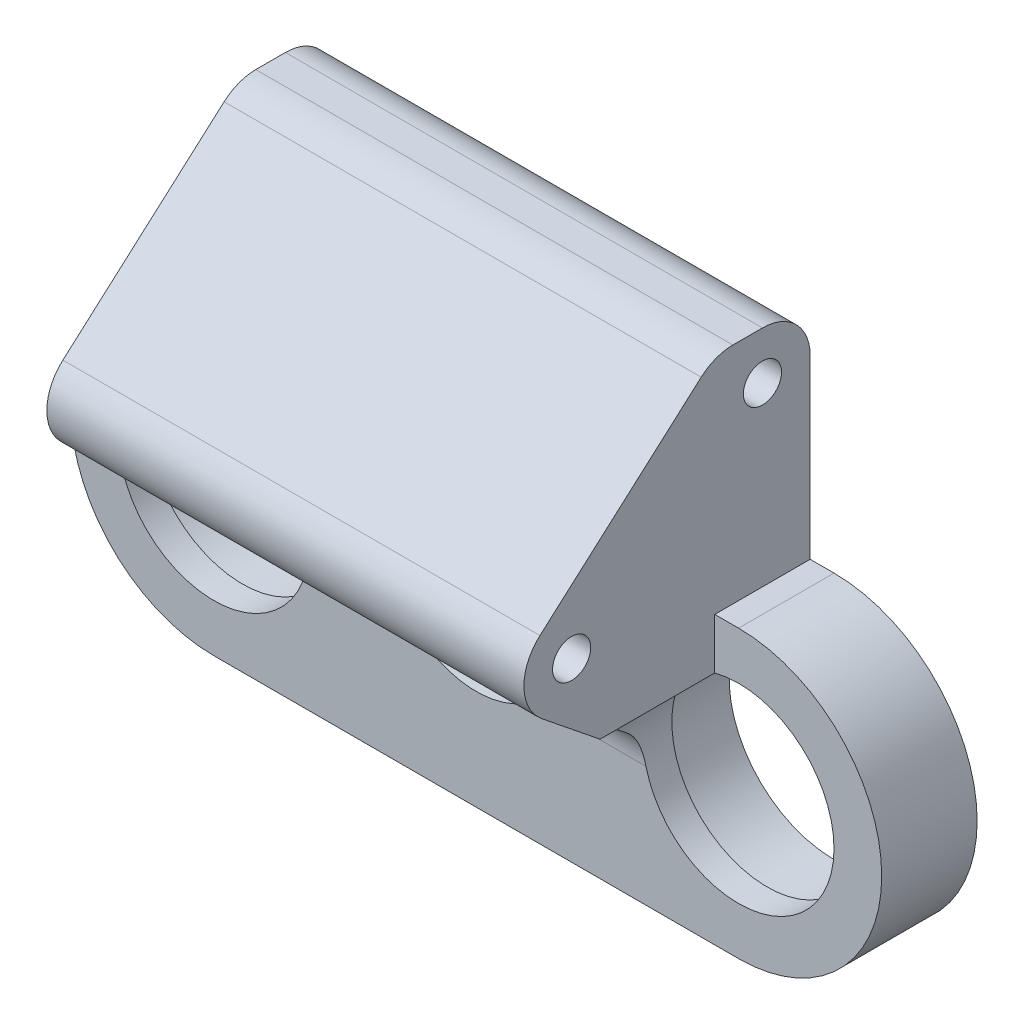
ISO-10303-21;
HEADER;
FILE_DESCRIPTION(('STEP AP214'),'2;1');
FILE_NAME('part.step','',(''),(''),'','','');
FILE_SCHEMA(('AUTOMOTIVE_DESIGN { 1 0 10303 214 1 1 1 1 }'));
ENDSEC;
DATA;
#1=APPLICATION_CONTEXT('core data for automotive mechanical design processes');
#2=APPLICATION_PROTOCOL_DEFINITION('international standard','automotive_design',2000,#1);
#3=PRODUCT_CONTEXT('',#1,'mechanical');
#4=PRODUCT('Part','Part','',(#3));
#5=PRODUCT_RELATED_PRODUCT_CATEGORY('part','',(#4));
#6=PRODUCT_DEFINITION_FORMATION('','',#4);
#7=PRODUCT_DEFINITION_CONTEXT('part definition',#1,'design');
#8=PRODUCT_DEFINITION('design','',#6,#7);
#9=PRODUCT_DEFINITION_SHAPE('','',#8);
#10=(LENGTH_UNIT() NAMED_UNIT(*) SI_UNIT(.MILLI.,.METRE.));
#11=(NAMED_UNIT(*) PLANE_ANGLE_UNIT() SI_UNIT($,.RADIAN.));
#12=(NAMED_UNIT(*) SI_UNIT($,.STERADIAN.) SOLID_ANGLE_UNIT());
#13=UNCERTAINTY_MEASURE_WITH_UNIT(LENGTH_MEASURE(1.E-05),#10,'distance_accuracy_value','');
#14=(GEOMETRIC_REPRESENTATION_CONTEXT(3) GLOBAL_UNCERTAINTY_ASSIGNED_CONTEXT((#13)) GLOBAL_UNIT_ASSIGNED_CONTEXT((#10,
#11,#12)) REPRESENTATION_CONTEXT('',''));
#15=CARTESIAN_POINT('',(0.,0.,0.));
#16=DIRECTION('',(0.,0.,1.));
#17=DIRECTION('',(1.,0.,0.));
#18=AXIS2_PLACEMENT_3D('',#15,#16,#17);
#19=CARTESIAN_POINT('',(0.,15.,10.));
#20=DIRECTION('',(0.,-1.,0.));
#21=DIRECTION('',(1.,0.,0.));
#22=AXIS2_PLACEMENT_3D('',#19,#20,#21);
#23=PLANE('',#22);
#24=DIRECTION('',(0.,0.,1.));
#25=VECTOR('',#24,1.);
#26=CARTESIAN_POINT('',(-25.,15.,0.));
#27=LINE('',#26,#25);
#28=CARTESIAN_POINT('',(-25.,15.,0.));
#29=VERTEX_POINT('',#28);
#30=CARTESIAN_POINT('',(-25.,15.,10.));
#31=VERTEX_POINT('',#30);
#32=EDGE_CURVE('E236',#29,#31,#27,.T.);
#33=ORIENTED_EDGE('',*,*,#32,.F.);
#34=DIRECTION('',(-1.,0.,0.));
#35=VECTOR('',#34,1.);
#36=CARTESIAN_POINT('',(0.,15.,0.));
#37=LINE('',#36,#35);
#38=CARTESIAN_POINT('',(-27.5,15.,0.));
#39=VERTEX_POINT('',#38);
#40=EDGE_CURVE('E277',#29,#39,#37,.T.);
#41=ORIENTED_EDGE('',*,*,#40,.T.);
#42=DIRECTION('',(0.,0.,-1.));
#43=VECTOR('',#42,1.);
#44=CARTESIAN_POINT('',(-27.5,15.,10.));
#45=LINE('',#44,#43);
#46=CARTESIAN_POINT('',(-27.5,15.,10.));
#47=VERTEX_POINT('',#46);
#48=EDGE_CURVE('E297',#47,#39,#45,.T.);
#49=ORIENTED_EDGE('',*,*,#48,.F.);
#50=DIRECTION('',(-1.,0.,0.));
#51=VECTOR('',#50,1.);
#52=CARTESIAN_POINT('',(0.,15.,10.));
#53=LINE('',#52,#51);
#54=EDGE_CURVE('E266',#31,#47,#53,.T.);
#55=ORIENTED_EDGE('',*,*,#54,.F.);
#56=EDGE_LOOP('',(#33,#41,#49,#55));
#57=FACE_BOUND('',#56,.T.);
#58=ADVANCED_FACE('F88',(#57),#23,.F.);
#59=CARTESIAN_POINT('',(0.,5.,10.));
#60=DIRECTION('',(0.,0.,-1.));
#61=DIRECTION('',(-1.,0.,0.));
#62=AXIS2_PLACEMENT_3D('',#59,#60,#61);
#63=CYLINDRICAL_SURFACE('',#62,9.5);
#64=CARTESIAN_POINT('',(0.,5.,16.208531287974));
#65=DIRECTION('',(0.,0.778834606726929,-0.627229348296545));
#66=DIRECTION('',(0.,-0.627229348296546,-0.77883460672693));
#67=AXIS2_PLACEMENT_3D('',#64,#65,#66);
#68=ELLIPSE('',#67,15.1459749544572,9.49999999999999);
#69=CARTESIAN_POINT('',(-8.83217374117434,1.50104201143964,11.8638532585173));
#70=VERTEX_POINT('',#69);
#71=CARTESIAN_POINT('',(8.83217374117434,1.50104201143964,11.8638532585173));
#72=VERTEX_POINT('',#71);
#73=EDGE_CURVE('E229',#70,#72,#68,.T.);
#74=ORIENTED_EDGE('',*,*,#73,.F.);
#75=CARTESIAN_POINT('',(-8.83217374117434,1.50104201143964,11.8638532585173));
#76=CARTESIAN_POINT('',(-8.79937837870814,1.41823773642315,11.7609838896426));
#77=CARTESIAN_POINT('',(-8.76376212731212,1.33175386015534,11.6619850211199));
#78=CARTESIAN_POINT('',(-8.68659905168116,1.15260280425315,11.4722955232034));
#79=CARTESIAN_POINT('',(-8.64505397800075,1.05993745405752,11.3816024543554));
#80=CARTESIAN_POINT('',(-8.55618956159777,0.870538286898988,11.2099270694883));
#81=CARTESIAN_POINT('',(-8.50893469998546,0.773856746149045,11.1288536473952));
#82=CARTESIAN_POINT('',(-8.40815792708898,0.57675153764262,10.9756525379476));
#83=CARTESIAN_POINT('',(-8.35463603182304,0.476327879451257,10.9035248277292));
#84=CARTESIAN_POINT('',(-8.24128435598691,0.272973418198548,10.7683578288384));
#85=CARTESIAN_POINT('',(-8.18145488405915,0.170042738000187,10.70531809583));
#86=CARTESIAN_POINT('',(-8.05553731637715,-0.0371641159293095,10.588244337141));
#87=CARTESIAN_POINT('',(-7.9894466138641,-0.141440834316979,10.5342140884769));
#88=CARTESIAN_POINT('',(-7.85090641147902,-0.350614079117348,10.4347402698558));
#89=CARTESIAN_POINT('',(-7.77843040309506,-0.455511323600859,10.3893352283801));
#90=CARTESIAN_POINT('',(-7.62763179995241,-0.66443685079868,10.3070019116986));
#91=CARTESIAN_POINT('',(-7.5493080106808,-0.768464951122962,10.2700753746901));
#92=CARTESIAN_POINT('',(-7.35999751433599,-1.00924781283061,10.1931567810846));
#93=CARTESIAN_POINT('',(-7.24685094969099,-1.14530576542051,10.1562734611221));
#94=CARTESIAN_POINT('',(-7.01153351893997,-1.41249947359612,10.0951891957309));
#95=CARTESIAN_POINT('',(-6.88935544716596,-1.54363117025511,10.0709985043054));
#96=CARTESIAN_POINT('',(-6.63757538882861,-1.79886272278748,10.0337736638761));
#97=CARTESIAN_POINT('',(-6.50801360133452,-1.92299447614091,10.0206843053133));
#98=CARTESIAN_POINT('',(-6.24196966997879,-2.16380523584075,10.0038080605852));
#99=CARTESIAN_POINT('',(-6.10550030484822,-2.28049716224859,10.0000045948124));
#100=CARTESIAN_POINT('',(-5.96587074019022,-2.39313102219501,10.));
#101=B_SPLINE_CURVE_WITH_KNOTS('',3,(#75,#76,#77,#78,#79,#80,#81,#82,#83,#84,#85,#86,#87,#88,
#89,#90,#91,#92,#93,#94,#95,#96,#97,#98,#99,#100),.UNSPECIFIED.,.F.,.F.,(4,2,2,2,2,2,2,2,2,2,2,
2,4),(0.,0.408059896019089,0.815999555881481,1.21970062575822,1.62340066381697,2.02708095718018,
2.4309300609278,2.83654277644303,3.24223857342848,3.78368523090544,4.32556863640213,
4.864741055292,5.40295009606931),.UNSPECIFIED.);
#102=CARTESIAN_POINT('',(-5.96587074019022,-2.39313102219501,10.));
#103=VERTEX_POINT('',#102);
#104=EDGE_CURVE('E12',#70,#103,#101,.T.);
#105=ORIENTED_EDGE('',*,*,#104,.T.);
#106=CARTESIAN_POINT('',(0.,5.,10.));
#107=DIRECTION('',(0.,0.,1.));
#108=DIRECTION('',(1.,0.,0.));
#109=AXIS2_PLACEMENT_3D('',#106,#107,#108);
#110=CIRCLE('',#109,9.5);
#111=CARTESIAN_POINT('',(5.96587074019022,-2.39313102219501,10.));
#112=VERTEX_POINT('',#111);
#113=EDGE_CURVE('E260',#103,#112,#110,.T.);
#114=ORIENTED_EDGE('',*,*,#113,.T.);
#115=CARTESIAN_POINT('',(5.96587074019022,-2.39313102219501,10.));
#116=CARTESIAN_POINT('',(6.10347010421152,-2.28213280439098,10.000004553618));
#117=CARTESIAN_POINT('',(6.23799945369006,-2.16719728646805,10.0036982063082));
#118=CARTESIAN_POINT('',(6.50036018826438,-1.93011427407039,10.0200626561571));
#119=CARTESIAN_POINT('',(6.62818008363108,-1.80795512404933,10.0327483456982));
#120=CARTESIAN_POINT('',(6.87681744720314,-1.5567387766679,10.0688101389606));
#121=CARTESIAN_POINT('',(6.99759023961192,-1.42764583405689,10.0922475242973));
#122=CARTESIAN_POINT('',(7.23039237811504,-1.16459426403602,10.1514074761815));
#123=CARTESIAN_POINT('',(7.34242789636078,-1.0306391711748,10.1871212722399));
#124=CARTESIAN_POINT('',(7.53542778367279,-0.786746528157732,10.2637119341491));
#125=CARTESIAN_POINT('',(7.61811309282972,-0.677389127423526,10.3021109280263));
#126=CARTESIAN_POINT('',(7.77701996070737,-0.457685109848573,10.3882796492948));
#127=CARTESIAN_POINT('',(7.85324287011983,-0.347338705074901,10.4360474115909));
#128=CARTESIAN_POINT('',(7.998570067161,-0.12739408276485,10.5411638937111));
#129=CARTESIAN_POINT('',(8.06770693239291,-0.0177948243950194,10.5984652658472));
#130=CARTESIAN_POINT('',(8.19906919237147,0.199852346082415,10.723067087673));
#131=CARTESIAN_POINT('',(8.26129526352045,0.307900409112185,10.7903665572768));
#132=CARTESIAN_POINT('',(8.37408725717405,0.512549441588461,10.9292417488496));
#133=CARTESIAN_POINT('',(8.42518704418424,0.609377019336433,11.0000507376948));
#134=CARTESIAN_POINT('',(8.52152538787706,0.799410158582833,11.1500215470849));
#135=CARTESIAN_POINT('',(8.5667642859028,0.892615930796725,11.2291828806945));
#136=CARTESIAN_POINT('',(8.65195219325743,1.07521103153369,11.3963827166724));
#137=CARTESIAN_POINT('',(8.69184466471507,1.16455368545048,11.4845010299503));
#138=CARTESIAN_POINT('',(8.76609595701615,1.33742595778112,11.6684899039356));
#139=CARTESIAN_POINT('',(8.80045305368584,1.42095376038591,11.7643628661689));
#140=CARTESIAN_POINT('',(8.83217374117434,1.50104201143964,11.8638532585173));
#141=B_SPLINE_CURVE_WITH_KNOTS('',3,(#115,#116,#117,#118,#119,#120,#121,#122,#123,#124,#125,
#126,#127,#128,#129,#130,#131,#132,#133,#134,#135,#136,#137,#138,#139,#140),.UNSPECIFIED.,.F.,
.F.,(4,2,2,2,2,2,2,2,2,2,2,2,4),(0.,0.530383753442043,1.06164797354417,1.59597860945558,
2.12992830058184,2.55663011642034,2.98324252727124,3.4077962144304,3.83230831119545,
4.22303141921132,4.61373176094453,5.00828323637127,5.40295737116777),.UNSPECIFIED.);
#142=EDGE_CURVE('E109',#112,#72,#141,.T.);
#143=ORIENTED_EDGE('',*,*,#142,.T.);
#144=EDGE_LOOP('',(#74,#105,#114,#143));
#145=FACE_BOUND('',#144,.T.);
#146=CARTESIAN_POINT('',(0.,5.,4.));
#147=DIRECTION('',(0.,0.,-1.));
#148=DIRECTION('',(-1.,0.,0.));
#149=AXIS2_PLACEMENT_3D('',#146,#147,#148);
#150=CIRCLE('',#149,9.5);
#151=CARTESIAN_POINT('',(-9.5,5.,4.));
#152=VERTEX_POINT('',#151);
#153=EDGE_CURVE('E444',#152,#152,#150,.T.);
#154=ORIENTED_EDGE('',*,*,#153,.T.);
#155=EDGE_LOOP('',(#154));
#156=FACE_BOUND('',#155,.T.);
#157=ADVANCED_FACE('F351',(#145,#156),#63,.F.);
#158=CARTESIAN_POINT('',(27.5,0.,10.));
#159=DIRECTION('',(0.,0.,-1.));
#160=DIRECTION('',(-1.,0.,0.));
#161=AXIS2_PLACEMENT_3D('',#158,#159,#160);
#162=CYLINDRICAL_SURFACE('',#161,11.);
#163=CARTESIAN_POINT('',(27.5,0.,0.));
#164=DIRECTION('',(0.,0.,1.));
#165=DIRECTION('',(1.,0.,0.));
#166=AXIS2_PLACEMENT_3D('',#163,#164,#165);
#167=CIRCLE('',#166,11.);
#168=CARTESIAN_POINT('',(38.5,0.,0.));
#169=VERTEX_POINT('',#168);
#170=EDGE_CURVE('E286',#169,#169,#167,.T.);
#171=ORIENTED_EDGE('',*,*,#170,.F.);
#172=EDGE_LOOP('',(#171));
#173=FACE_BOUND('',#172,.T.);
#174=CARTESIAN_POINT('',(27.5,0.,7.));
#175=DIRECTION('',(0.,0.,1.));
#176=DIRECTION('',(1.,0.,0.));
#177=AXIS2_PLACEMENT_3D('',#174,#175,#176);
#178=CIRCLE('',#177,11.);
#179=CARTESIAN_POINT('',(38.5,0.,7.));
#180=VERTEX_POINT('',#179);
#181=EDGE_CURVE('E248',#180,#180,#178,.T.);
#182=ORIENTED_EDGE('',*,*,#181,.T.);
#183=EDGE_LOOP('',(#182));
#184=FACE_BOUND('',#183,.T.);
#185=ADVANCED_FACE('F356',(#173,#184),#162,.F.);
#186=CARTESIAN_POINT('',(-27.5,0.,10.));
#187=DIRECTION('',(0.,0.,-1.));
#188=DIRECTION('',(-1.,0.,0.));
#189=AXIS2_PLACEMENT_3D('',#186,#187,#188);
#190=CYLINDRICAL_SURFACE('',#189,11.);
#191=CARTESIAN_POINT('',(-27.5,0.,0.));
#192=DIRECTION('',(0.,0.,1.));
#193=DIRECTION('',(1.,0.,0.));
#194=AXIS2_PLACEMENT_3D('',#191,#192,#193);
#195=CIRCLE('',#194,11.);
#196=CARTESIAN_POINT('',(-16.5,0.,0.));
#197=VERTEX_POINT('',#196);
#198=EDGE_CURVE('E263',#197,#197,#195,.T.);
#199=ORIENTED_EDGE('',*,*,#198,.F.);
#200=EDGE_LOOP('',(#199));
#201=FACE_BOUND('',#200,.T.);
#202=CARTESIAN_POINT('',(-27.5,0.,7.));
#203=DIRECTION('',(0.,0.,1.));
#204=DIRECTION('',(1.,0.,0.));
#205=AXIS2_PLACEMENT_3D('',#202,#203,#204);
#206=CIRCLE('',#205,11.);
#207=CARTESIAN_POINT('',(-16.5,0.,7.));
#208=VERTEX_POINT('',#207);
#209=EDGE_CURVE('E251',#208,#208,#206,.T.);
#210=ORIENTED_EDGE('',*,*,#209,.T.);
#211=EDGE_LOOP('',(#210));
#212=FACE_BOUND('',#211,.T.);
#213=ADVANCED_FACE('F382',(#201,#212),#190,.F.);
#214=CARTESIAN_POINT('',(27.5,15.,0.));
#215=VERTEX_POINT('',#214);
#216=CARTESIAN_POINT('',(25.,15.,0.));
#217=VERTEX_POINT('',#216);
#218=EDGE_CURVE('E259',#215,#217,#37,.T.);
#219=ORIENTED_EDGE('',*,*,#218,.T.);
#220=DIRECTION('',(0.,0.,1.));
#221=VECTOR('',#220,1.);
#222=CARTESIAN_POINT('',(25.,15.,0.));
#223=LINE('',#222,#221);
#224=CARTESIAN_POINT('',(25.,15.,10.));
#225=VERTEX_POINT('',#224);
#226=EDGE_CURVE('E396',#217,#225,#223,.T.);
#227=ORIENTED_EDGE('',*,*,#226,.T.);
#228=CARTESIAN_POINT('',(27.5,15.,10.));
#229=VERTEX_POINT('',#228);
#230=EDGE_CURVE('E262',#229,#225,#53,.T.);
#231=ORIENTED_EDGE('',*,*,#230,.F.);
#232=DIRECTION('',(0.,0.,-1.));
#233=VECTOR('',#232,1.);
#234=CARTESIAN_POINT('',(27.5,15.,10.));
#235=LINE('',#234,#233);
#236=EDGE_CURVE('E274',#229,#215,#235,.T.);
#237=ORIENTED_EDGE('',*,*,#236,.T.);
#238=EDGE_LOOP('',(#219,#227,#231,#237));
#239=FACE_BOUND('',#238,.T.);
#240=ADVANCED_FACE('F377',(#239),#23,.F.);
#241=CARTESIAN_POINT('',(-27.5,0.,10.));
#242=DIRECTION('',(0.,0.,-1.));
#243=DIRECTION('',(-1.,0.,0.));
#244=AXIS2_PLACEMENT_3D('',#241,#242,#243);
#245=CYLINDRICAL_SURFACE('',#244,15.);
#246=CARTESIAN_POINT('',(-27.5,0.,0.));
#247=DIRECTION('',(0.,0.,1.));
#248=DIRECTION('',(1.,0.,0.));
#249=AXIS2_PLACEMENT_3D('',#246,#247,#248);
#250=CIRCLE('',#249,15.);
#251=CARTESIAN_POINT('',(-27.5,-15.,0.));
#252=VERTEX_POINT('',#251);
#253=EDGE_CURVE('E278',#39,#252,#250,.T.);
#254=ORIENTED_EDGE('',*,*,#253,.T.);
#255=DIRECTION('',(0.,0.,-1.));
#256=VECTOR('',#255,1.);
#257=CARTESIAN_POINT('',(-27.5,-15.,10.));
#258=LINE('',#257,#256);
#259=CARTESIAN_POINT('',(-27.5,-15.,10.));
#260=VERTEX_POINT('',#259);
#261=EDGE_CURVE('E295',#260,#252,#258,.T.);
#262=ORIENTED_EDGE('',*,*,#261,.F.);
#263=CARTESIAN_POINT('',(-27.5,0.,10.));
#264=DIRECTION('',(0.,0.,1.));
#265=DIRECTION('',(1.,0.,0.));
#266=AXIS2_PLACEMENT_3D('',#263,#264,#265);
#267=CIRCLE('',#266,15.);
#268=EDGE_CURVE('E267',#47,#260,#267,.T.);
#269=ORIENTED_EDGE('',*,*,#268,.F.);
#270=ORIENTED_EDGE('',*,*,#48,.T.);
#271=EDGE_LOOP('',(#254,#262,#269,#270));
#272=FACE_BOUND('',#271,.T.);
#273=ADVANCED_FACE('F381',(#272),#245,.T.);
#274=CARTESIAN_POINT('',(0.,-15.,10.));
#275=DIRECTION('',(0.,-1.,0.));
#276=DIRECTION('',(1.,0.,0.));
#277=AXIS2_PLACEMENT_3D('',#274,#275,#276);
#278=PLANE('',#277);
#279=DIRECTION('',(-1.,0.,0.));
#280=VECTOR('',#279,1.);
#281=CARTESIAN_POINT('',(0.,-15.,0.));
#282=LINE('',#281,#280);
#283=CARTESIAN_POINT('',(27.5,-15.,0.));
#284=VERTEX_POINT('',#283);
#285=EDGE_CURVE('E281',#284,#252,#282,.T.);
#286=ORIENTED_EDGE('',*,*,#285,.F.);
#287=DIRECTION('',(0.,0.,-1.));
#288=VECTOR('',#287,1.);
#289=CARTESIAN_POINT('',(27.5,-15.,10.));
#290=LINE('',#289,#288);
#291=CARTESIAN_POINT('',(27.5,-15.,10.));
#292=VERTEX_POINT('',#291);
#293=EDGE_CURVE('E293',#292,#284,#290,.T.);
#294=ORIENTED_EDGE('',*,*,#293,.F.);
#295=DIRECTION('',(-1.,0.,0.));
#296=VECTOR('',#295,1.);
#297=CARTESIAN_POINT('',(0.,-15.,10.));
#298=LINE('',#297,#296);
#299=EDGE_CURVE('E269',#292,#260,#298,.T.);
#300=ORIENTED_EDGE('',*,*,#299,.T.);
#301=ORIENTED_EDGE('',*,*,#261,.T.);
#302=EDGE_LOOP('',(#286,#294,#300,#301));
#303=FACE_BOUND('',#302,.T.);
#304=ADVANCED_FACE('F388',(#303),#278,.T.);
#305=CARTESIAN_POINT('',(27.5,0.,10.));
#306=DIRECTION('',(0.,0.,-1.));
#307=DIRECTION('',(-1.,0.,0.));
#308=AXIS2_PLACEMENT_3D('',#305,#306,#307);
#309=CYLINDRICAL_SURFACE('',#308,15.);
#310=CARTESIAN_POINT('',(27.5,0.,0.));
#311=DIRECTION('',(0.,0.,1.));
#312=DIRECTION('',(1.,0.,0.));
#313=AXIS2_PLACEMENT_3D('',#310,#311,#312);
#314=CIRCLE('',#313,15.);
#315=EDGE_CURVE('E284',#284,#215,#314,.T.);
#316=ORIENTED_EDGE('',*,*,#315,.T.);
#317=ORIENTED_EDGE('',*,*,#236,.F.);
#318=CARTESIAN_POINT('',(27.5,0.,10.));
#319=DIRECTION('',(0.,0.,1.));
#320=DIRECTION('',(1.,0.,0.));
#321=AXIS2_PLACEMENT_3D('',#318,#319,#320);
#322=CIRCLE('',#321,15.);
#323=EDGE_CURVE('E272',#292,#229,#322,.T.);
#324=ORIENTED_EDGE('',*,*,#323,.F.);
#325=ORIENTED_EDGE('',*,*,#293,.T.);
#326=EDGE_LOOP('',(#316,#317,#324,#325));
#327=FACE_BOUND('',#326,.T.);
#328=ADVANCED_FACE('F464',(#327),#309,.T.);
#329=CARTESIAN_POINT('',(0.,0.,10.));
#330=DIRECTION('',(0.,0.,1.));
#331=DIRECTION('',(1.,0.,0.));
#332=AXIS2_PLACEMENT_3D('',#329,#330,#331);
#333=PLANE('',#332);
#334=CARTESIAN_POINT('',(27.5,0.,10.));
#335=DIRECTION('',(0.,0.,1.));
#336=DIRECTION('',(1.,0.,0.));
#337=AXIS2_PLACEMENT_3D('',#334,#335,#336);
#338=CIRCLE('',#337,9.99999999999999);
#339=CARTESIAN_POINT('',(17.7905755108448,-2.39313102219501,10.));
#340=VERTEX_POINT('',#339);
#341=CARTESIAN_POINT('',(25.,9.68245836551854,10.));
#342=VERTEX_POINT('',#341);
#343=EDGE_CURVE('E449',#340,#342,#338,.T.);
#344=ORIENTED_EDGE('',*,*,#343,.F.);
#345=DIRECTION('',(-1.,0.,0.));
#346=VECTOR('',#345,1.);
#347=CARTESIAN_POINT('',(0.,-2.39313102219501,10.));
#348=LINE('',#347,#346);
#349=EDGE_CURVE('E331',#340,#112,#348,.T.);
#350=ORIENTED_EDGE('',*,*,#349,.T.);
#351=ORIENTED_EDGE('',*,*,#113,.F.);
#352=DIRECTION('',(-1.,0.,0.));
#353=VECTOR('',#352,1.);
#354=CARTESIAN_POINT('',(0.,-2.39313102219501,10.));
#355=LINE('',#354,#353);
#356=CARTESIAN_POINT('',(-17.7905755108447,-2.39313102219501,10.));
#357=VERTEX_POINT('',#356);
#358=EDGE_CURVE('E246',#103,#357,#355,.T.);
#359=ORIENTED_EDGE('',*,*,#358,.T.);
#360=CARTESIAN_POINT('',(-27.5,0.,10.));
#361=DIRECTION('',(0.,0.,1.));
#362=DIRECTION('',(1.,0.,0.));
#363=AXIS2_PLACEMENT_3D('',#360,#361,#362);
#364=CIRCLE('',#363,10.);
#365=CARTESIAN_POINT('',(-25.,9.68245836551853,10.));
#366=VERTEX_POINT('',#365);
#367=EDGE_CURVE('E223',#366,#357,#364,.T.);
#368=ORIENTED_EDGE('',*,*,#367,.F.);
#369=DIRECTION('',(0.,-1.,0.));
#370=VECTOR('',#369,1.);
#371=CARTESIAN_POINT('',(-25.,15.,10.));
#372=LINE('',#371,#370);
#373=EDGE_CURVE('E232',#31,#366,#372,.T.);
#374=ORIENTED_EDGE('',*,*,#373,.F.);
#375=ORIENTED_EDGE('',*,*,#54,.T.);
#376=ORIENTED_EDGE('',*,*,#268,.T.);
#377=ORIENTED_EDGE('',*,*,#299,.F.);
#378=ORIENTED_EDGE('',*,*,#323,.T.);
#379=ORIENTED_EDGE('',*,*,#230,.T.);
#380=DIRECTION('',(0.,-1.,0.));
#381=VECTOR('',#380,1.);
#382=CARTESIAN_POINT('',(25.,15.,10.));
#383=LINE('',#382,#381);
#384=EDGE_CURVE('E415',#225,#342,#383,.T.);
#385=ORIENTED_EDGE('',*,*,#384,.T.);
#386=EDGE_LOOP('',(#344,#350,#351,#359,#368,#374,#375,#376,#377,#378,#379,#385));
#387=FACE_BOUND('',#386,.T.);
#388=ADVANCED_FACE('F243',(#387),#333,.T.);
#389=CARTESIAN_POINT('',(0.,0.,0.));
#390=DIRECTION('',(0.,0.,1.));
#391=DIRECTION('',(1.,0.,0.));
#392=AXIS2_PLACEMENT_3D('',#389,#390,#391);
#393=PLANE('',#392);
#394=DIRECTION('',(0.,1.,0.));
#395=VECTOR('',#394,1.);
#396=CARTESIAN_POINT('',(-25.,15.,0.));
#397=LINE('',#396,#395);
#398=CARTESIAN_POINT('',(-25.,33.5,0.));
#399=VERTEX_POINT('',#398);
#400=EDGE_CURVE('E416',#29,#399,#397,.T.);
#401=ORIENTED_EDGE('',*,*,#400,.T.);
#402=DIRECTION('',(-1.,0.,0.));
#403=VECTOR('',#402,1.);
#404=CARTESIAN_POINT('',(0.,33.5,0.));
#405=LINE('',#404,#403);
#406=CARTESIAN_POINT('',(25.,33.5,0.));
#407=VERTEX_POINT('',#406);
#408=EDGE_CURVE('E325',#399,#407,#405,.F.);
#409=ORIENTED_EDGE('',*,*,#408,.T.);
#410=DIRECTION('',(0.,1.,0.));
#411=VECTOR('',#410,1.);
#412=CARTESIAN_POINT('',(25.,18.5,0.));
#413=LINE('',#412,#411);
#414=EDGE_CURVE('E405',#217,#407,#413,.T.);
#415=ORIENTED_EDGE('',*,*,#414,.F.);
#416=ORIENTED_EDGE('',*,*,#218,.F.);
#417=ORIENTED_EDGE('',*,*,#315,.F.);
#418=ORIENTED_EDGE('',*,*,#285,.T.);
#419=ORIENTED_EDGE('',*,*,#253,.F.);
#420=ORIENTED_EDGE('',*,*,#40,.F.);
#421=EDGE_LOOP('',(#401,#409,#415,#416,#417,#418,#419,#420));
#422=FACE_BOUND('',#421,.T.);
#423=ORIENTED_EDGE('',*,*,#170,.T.);
#424=EDGE_LOOP('',(#423));
#425=FACE_BOUND('',#424,.T.);
#426=ORIENTED_EDGE('',*,*,#198,.T.);
#427=EDGE_LOOP('',(#426));
#428=FACE_BOUND('',#427,.T.);
#429=CARTESIAN_POINT('',(0.,5.,0.));
#430=DIRECTION('',(0.,0.,-1.));
#431=DIRECTION('',(-1.,0.,0.));
#432=AXIS2_PLACEMENT_3D('',#429,#430,#431);
#433=CIRCLE('',#432,8.5);
#434=CARTESIAN_POINT('',(-8.5,5.,0.));
#435=VERTEX_POINT('',#434);
#436=EDGE_CURVE('E408',#435,#435,#433,.T.);
#437=ORIENTED_EDGE('',*,*,#436,.F.);
#438=EDGE_LOOP('',(#437));
#439=FACE_BOUND('',#438,.T.);
#440=ADVANCED_FACE('F401',(#422,#425,#428,#439),#393,.F.);
#441=CARTESIAN_POINT('',(-27.5,0.,7.));
#442=DIRECTION('',(0.,0.,1.));
#443=DIRECTION('',(1.,0.,0.));
#444=AXIS2_PLACEMENT_3D('',#441,#442,#443);
#445=PLANE('',#444);
#446=CARTESIAN_POINT('',(-27.5,0.,7.));
#447=DIRECTION('',(0.,0.,1.));
#448=DIRECTION('',(1.,0.,0.));
#449=AXIS2_PLACEMENT_3D('',#446,#447,#448);
#450=CIRCLE('',#449,10.);
#451=CARTESIAN_POINT('',(-17.5,0.,7.));
#452=VERTEX_POINT('',#451);
#453=EDGE_CURVE('E247',#452,#452,#450,.T.);
#454=ORIENTED_EDGE('',*,*,#453,.T.);
#455=EDGE_LOOP('',(#454));
#456=FACE_BOUND('',#455,.T.);
#457=ORIENTED_EDGE('',*,*,#209,.F.);
#458=EDGE_LOOP('',(#457));
#459=FACE_BOUND('',#458,.T.);
#460=ADVANCED_FACE('F498',(#456,#459),#445,.F.);
#461=CARTESIAN_POINT('',(-27.5,0.,7.));
#462=DIRECTION('',(0.,0.,1.));
#463=DIRECTION('',(1.,0.,0.));
#464=AXIS2_PLACEMENT_3D('',#461,#462,#463);
#465=CYLINDRICAL_SURFACE('',#464,10.);
#466=ORIENTED_EDGE('',*,*,#453,.F.);
#467=EDGE_LOOP('',(#466));
#468=FACE_BOUND('',#467,.T.);
#469=ORIENTED_EDGE('',*,*,#367,.T.);
#470=CARTESIAN_POINT('',(-17.7905755108447,-2.39313102219501,10.));
#471=CARTESIAN_POINT('',(-17.7596707834307,-2.26783575926706,9.9999795711148));
#472=CARTESIAN_POINT('',(-17.731230295553,-2.14191993462361,10.0047091885669));
#473=CARTESIAN_POINT('',(-17.6793496933688,-1.88978238771914,10.023799467444));
#474=CARTESIAN_POINT('',(-17.6559098810544,-1.76356064744906,10.0381607103084));
#475=CARTESIAN_POINT('',(-17.6141898237008,-1.51226510359151,10.0765683091091));
#476=CARTESIAN_POINT('',(-17.595889329084,-1.38718872818552,10.1005757217261));
#477=CARTESIAN_POINT('',(-17.5642490758504,-1.1386560593183,10.1582480748786));
#478=CARTESIAN_POINT('',(-17.5509089405862,-1.01519964353815,10.1919122818155));
#479=CARTESIAN_POINT('',(-17.5289873185559,-0.770708243773723,10.2688070872331));
#480=CARTESIAN_POINT('',(-17.5204115297455,-0.649676325344922,10.3120490542718));
#481=CARTESIAN_POINT('',(-17.5077375211924,-0.41106382830339,10.4078385193368));
#482=CARTESIAN_POINT('',(-17.5036409999236,-0.293484575325932,10.4603895384514));
#483=CARTESIAN_POINT('',(-17.4995293195947,-0.0626091338701522,10.5744775278757));
#484=CARTESIAN_POINT('',(-17.4995164328864,0.0506846348799591,10.6360194821668));
#485=CARTESIAN_POINT('',(-17.5030893501764,0.272153637379084,10.7676386227989));
#486=CARTESIAN_POINT('',(-17.5066765149268,0.38032691949018,10.8377190277144));
#487=CARTESIAN_POINT('',(-17.5210759888487,0.676349738432519,11.0461933064468));
#488=CARTESIAN_POINT('',(-17.5353888221899,0.857649416562944,11.1938868325461));
#489=CARTESIAN_POINT('',(-17.5616847358757,1.11230258014236,11.432714102411));
#490=CARTESIAN_POINT('',(-17.5712510643283,1.19428329917538,11.5151783424487));
#491=CARTESIAN_POINT('',(-17.5915300967936,1.35223368426126,11.6855311258444));
#492=CARTESIAN_POINT('',(-17.6022426985908,1.42820388523425,11.7734191852549));
#493=CARTESIAN_POINT('',(-17.6132981798836,1.50104201143964,11.8638532585173));
#494=B_SPLINE_CURVE_WITH_KNOTS('',3,(#470,#471,#472,#473,#474,#475,#476,#477,#478,#479,#480,
#481,#482,#483,#484,#485,#486,#487,#488,#489,#490,#491,#492,#493),.UNSPECIFIED.,.F.,.F.,(4,2,2,
2,2,2,2,2,2,2,2,4),(0.,0.387057987245352,0.774139342407724,1.15967343515574,1.54517824774905,
1.93114312060777,2.31725429510548,2.70358032205227,3.09005242803032,3.790031922393,
4.13982195858646,4.4895808292968),.UNSPECIFIED.);
#495=CARTESIAN_POINT('',(-17.6132981798836,1.50104201143964,11.8638532585173));
#496=VERTEX_POINT('',#495);
#497=EDGE_CURVE('E102',#357,#496,#494,.T.);
#498=ORIENTED_EDGE('',*,*,#497,.T.);
#499=CARTESIAN_POINT('',(-27.5,0.,9.99999999999998));
#500=DIRECTION('',(0.,0.778834606726929,-0.627229348296545));
#501=DIRECTION('',(0.,-0.627229348296546,-0.77883460672693));
#502=AXIS2_PLACEMENT_3D('',#499,#500,#501);
#503=ELLIPSE('',#502,15.9431315310076,10.);
#504=CARTESIAN_POINT('',(-25.,9.68245836551853,22.0227691413655));
#505=VERTEX_POINT('',#504);
#506=EDGE_CURVE('E224',#505,#496,#503,.T.);
#507=ORIENTED_EDGE('',*,*,#506,.F.);
#508=DIRECTION('',(0.,0.,-1.));
#509=VECTOR('',#508,1.);
#510=CARTESIAN_POINT('',(-25.,9.68245836551853,60.));
#511=LINE('',#510,#509);
#512=EDGE_CURVE('E219',#366,#505,#511,.F.);
#513=ORIENTED_EDGE('',*,*,#512,.F.);
#514=EDGE_LOOP('',(#469,#498,#507,#513));
#515=FACE_BOUND('',#514,.T.);
#516=ADVANCED_FACE('F221',(#468,#515),#465,.F.);
#517=CARTESIAN_POINT('',(27.5,0.,7.));
#518=DIRECTION('',(0.,0.,1.));
#519=DIRECTION('',(1.,0.,0.));
#520=AXIS2_PLACEMENT_3D('',#517,#518,#519);
#521=PLANE('',#520);
#522=CARTESIAN_POINT('',(27.5,0.,7.));
#523=DIRECTION('',(0.,0.,1.));
#524=DIRECTION('',(1.,0.,0.));
#525=AXIS2_PLACEMENT_3D('',#522,#523,#524);
#526=CIRCLE('',#525,9.99999999999999);
#527=CARTESIAN_POINT('',(37.5,0.,7.));
#528=VERTEX_POINT('',#527);
#529=EDGE_CURVE('E254',#528,#528,#526,.T.);
#530=ORIENTED_EDGE('',*,*,#529,.T.);
#531=EDGE_LOOP('',(#530));
#532=FACE_BOUND('',#531,.T.);
#533=ORIENTED_EDGE('',*,*,#181,.F.);
#534=EDGE_LOOP('',(#533));
#535=FACE_BOUND('',#534,.T.);
#536=ADVANCED_FACE('F497',(#532,#535),#521,.F.);
#537=CARTESIAN_POINT('',(27.5,0.,7.));
#538=DIRECTION('',(0.,0.,1.));
#539=DIRECTION('',(1.,0.,0.));
#540=AXIS2_PLACEMENT_3D('',#537,#538,#539);
#541=CYLINDRICAL_SURFACE('',#540,9.99999999999999);
#542=ORIENTED_EDGE('',*,*,#529,.F.);
#543=EDGE_LOOP('',(#542));
#544=FACE_BOUND('',#543,.T.);
#545=CARTESIAN_POINT('',(27.5,0.,10.));
#546=DIRECTION('',(0.,0.778834606726929,-0.627229348296545));
#547=DIRECTION('',(0.,-0.627229348296546,-0.77883460672693));
#548=AXIS2_PLACEMENT_3D('',#545,#546,#547);
#549=ELLIPSE('',#548,15.9431315310076,9.99999999999999);
#550=CARTESIAN_POINT('',(17.6132981798836,1.50104201143964,11.8638532585173));
#551=VERTEX_POINT('',#550);
#552=CARTESIAN_POINT('',(25.,9.68245836551854,22.0227691413655));
#553=VERTEX_POINT('',#552);
#554=EDGE_CURVE('E328',#551,#553,#549,.T.);
#555=ORIENTED_EDGE('',*,*,#554,.F.);
#556=CARTESIAN_POINT('',(17.6132981798836,1.50104201143964,11.8638532585173));
#557=CARTESIAN_POINT('',(17.6004772115825,1.41661088538977,11.7589975251784));
#558=CARTESIAN_POINT('',(17.5881164294824,1.32789535481104,11.6575237602176));
#559=CARTESIAN_POINT('',(17.5650341209497,1.14244205877223,11.4619410649116));
#560=CARTESIAN_POINT('',(17.5543130385423,1.0457021312319,11.3678341328364));
#561=CARTESIAN_POINT('',(17.5352265399947,0.844685611275362,11.1875471625806));
#562=CARTESIAN_POINT('',(17.526863651531,0.740401081288909,11.101375696284));
#563=CARTESIAN_POINT('',(17.5132119602758,0.525070538338219,10.9376871942674));
#564=CARTESIAN_POINT('',(17.507922819933,0.414025269301387,10.8601692089998));
#565=CARTESIAN_POINT('',(17.5010672931667,0.185577763914975,10.7141285934246));
#566=CARTESIAN_POINT('',(17.4995122095928,0.0681573242901957,10.6456338660625));
#567=CARTESIAN_POINT('',(17.5007566026429,-0.171851194844283,10.5184420001929));
#568=CARTESIAN_POINT('',(17.5035559027129,-0.294439064637963,10.4597444645529));
#569=CARTESIAN_POINT('',(17.5140102863388,-0.543617662359714,10.3526728907877));
#570=CARTESIAN_POINT('',(17.5216573831139,-0.670201481610778,10.3042820471665));
#571=CARTESIAN_POINT('',(17.542175936422,-0.926438138361929,10.2180437244155));
#572=CARTESIAN_POINT('',(17.5550462606183,-1.05609030494588,10.180193963095));
#573=CARTESIAN_POINT('',(17.5944491835914,-1.3856449350497,10.0982808035464));
#574=CARTESIAN_POINT('',(17.6246063312101,-1.58694515013533,10.0612590670813));
#575=CARTESIAN_POINT('',(17.6795690862988,-1.88937398206987,10.0243974422686));
#576=CARTESIAN_POINT('',(17.6995387287621,-1.99037557185471,10.0152222878534));
#577=CARTESIAN_POINT('',(17.7426732621793,-2.19207923276497,10.0030235168589));
#578=CARTESIAN_POINT('',(17.765838472558,-2.29278127291854,10.0000005157174));
#579=CARTESIAN_POINT('',(17.7905755108448,-2.39313102219501,10.));
#580=B_SPLINE_CURVE_WITH_KNOTS('',3,(#556,#557,#558,#559,#560,#561,#562,#563,#564,#565,#566,
#567,#568,#569,#570,#571,#572,#573,#574,#575,#576,#577,#578,#579),.UNSPECIFIED.,.F.,.F.,(4,2,2,
2,2,2,2,2,2,2,2,4),(0.,0.405600614950893,0.811310871474701,1.21745435770086,1.62355323384852,
2.03087981499838,2.43818988101084,2.84483063845905,3.25138328783605,3.86981090921919,
4.17971254338778,4.48964517739685),.UNSPECIFIED.);
#581=EDGE_CURVE('E342',#551,#340,#580,.T.);
#582=ORIENTED_EDGE('',*,*,#581,.T.);
#583=ORIENTED_EDGE('',*,*,#343,.T.);
#584=DIRECTION('',(0.,0.,-1.));
#585=VECTOR('',#584,1.);
#586=CARTESIAN_POINT('',(25.,9.68245836551854,60.));
#587=LINE('',#586,#585);
#588=EDGE_CURVE('E228',#342,#553,#587,.F.);
#589=ORIENTED_EDGE('',*,*,#588,.T.);
#590=EDGE_LOOP('',(#555,#582,#583,#589));
#591=FACE_BOUND('',#590,.T.);
#592=ADVANCED_FACE('F455',(#544,#591),#541,.F.);
#593=CARTESIAN_POINT('',(0.,5.,4.));
#594=DIRECTION('',(0.,0.,-1.));
#595=DIRECTION('',(-1.,0.,0.));
#596=AXIS2_PLACEMENT_3D('',#593,#594,#595);
#597=PLANE('',#596);
#598=CARTESIAN_POINT('',(0.,5.,4.));
#599=DIRECTION('',(0.,0.,-1.));
#600=DIRECTION('',(-1.,0.,0.));
#601=AXIS2_PLACEMENT_3D('',#598,#599,#600);
#602=CIRCLE('',#601,8.5);
#603=CARTESIAN_POINT('',(-8.5,5.,4.));
#604=VERTEX_POINT('',#603);
#605=EDGE_CURVE('E441',#604,#604,#602,.T.);
#606=ORIENTED_EDGE('',*,*,#605,.T.);
#607=EDGE_LOOP('',(#606));
#608=FACE_BOUND('',#607,.T.);
#609=ORIENTED_EDGE('',*,*,#153,.F.);
#610=EDGE_LOOP('',(#609));
#611=FACE_BOUND('',#610,.T.);
#612=ADVANCED_FACE('F555',(#608,#611),#597,.F.);
#613=CARTESIAN_POINT('',(0.,5.,4.));
#614=DIRECTION('',(0.,0.,-1.));
#615=DIRECTION('',(-1.,0.,0.));
#616=AXIS2_PLACEMENT_3D('',#613,#614,#615);
#617=CYLINDRICAL_SURFACE('',#616,8.5);
#618=ORIENTED_EDGE('',*,*,#605,.F.);
#619=EDGE_LOOP('',(#618));
#620=FACE_BOUND('',#619,.T.);
#621=ORIENTED_EDGE('',*,*,#436,.T.);
#622=EDGE_LOOP('',(#621));
#623=FACE_BOUND('',#622,.T.);
#624=ADVANCED_FACE('F562',(#620,#623),#617,.F.);
#625=CARTESIAN_POINT('',(25.,0.,0.));
#626=DIRECTION('',(1.,0.,0.));
#627=DIRECTION('',(0.,0.,-1.));
#628=AXIS2_PLACEMENT_3D('',#625,#626,#627);
#629=PLANE('',#628);
#630=ORIENTED_EDGE('',*,*,#588,.F.);
#631=ORIENTED_EDGE('',*,*,#384,.F.);
#632=ORIENTED_EDGE('',*,*,#226,.F.);
#633=ORIENTED_EDGE('',*,*,#414,.T.);
#634=CARTESIAN_POINT('',(25.,33.5,5.));
#635=DIRECTION('',(1.,0.,0.));
#636=DIRECTION('',(0.,0.,-1.));
#637=AXIS2_PLACEMENT_3D('',#634,#635,#636);
#638=CIRCLE('',#637,5.);
#639=CARTESIAN_POINT('',(25.,38.5,5.));
#640=VERTEX_POINT('',#639);
#641=EDGE_CURVE('E314',#407,#640,#638,.T.);
#642=ORIENTED_EDGE('',*,*,#641,.T.);
#643=DIRECTION('',(0.,0.,1.));
#644=VECTOR('',#643,1.);
#645=CARTESIAN_POINT('',(25.,38.5,0.));
#646=LINE('',#645,#644);
#647=CARTESIAN_POINT('',(25.,38.5,8.10102051443364));
#648=VERTEX_POINT('',#647);
#649=EDGE_CURVE('E409',#640,#648,#646,.T.);
#650=ORIENTED_EDGE('',*,*,#649,.T.);
#651=CARTESIAN_POINT('',(25.,33.5,8.10102051443364));
#652=DIRECTION('',(1.,0.,0.));
#653=DIRECTION('',(0.,0.,-1.));
#654=AXIS2_PLACEMENT_3D('',#651,#652,#653);
#655=CIRCLE('',#654,5.);
#656=CARTESIAN_POINT('',(25.,37.2393876913398,11.4202041028867));
#657=VERTEX_POINT('',#656);
#658=EDGE_CURVE('E316',#648,#657,#655,.T.);
#659=ORIENTED_EDGE('',*,*,#658,.T.);
#660=DIRECTION('',(0.,-0.663836717690617,0.747877538267963));
#661=VECTOR('',#660,1.);
#662=CARTESIAN_POINT('',(25.,38.5,10.));
#663=LINE('',#662,#661);
#664=CARTESIAN_POINT('',(25.,22.2393876913398,28.3191835884531));
#665=VERTEX_POINT('',#664);
#666=EDGE_CURVE('E428',#657,#665,#663,.T.);
#667=ORIENTED_EDGE('',*,*,#666,.T.);
#668=CARTESIAN_POINT('',(25.,18.5,25.));
#669=DIRECTION('',(1.,0.,0.));
#670=DIRECTION('',(0.,0.,-1.));
#671=AXIS2_PLACEMENT_3D('',#668,#669,#670);
#672=CIRCLE('',#671,5.);
#673=CARTESIAN_POINT('',(25.,14.6058269663653,28.1361467414827));
#674=VERTEX_POINT('',#673);
#675=EDGE_CURVE('E318',#665,#674,#672,.T.);
#676=ORIENTED_EDGE('',*,*,#675,.T.);
#677=DIRECTION('',(0.,-0.627229348296546,-0.77883460672693));
#678=VECTOR('',#677,1.);
#679=CARTESIAN_POINT('',(25.,18.3143849130471,32.7410863505304));
#680=LINE('',#679,#678);
#681=EDGE_CURVE('E418',#674,#553,#680,.T.);
#682=ORIENTED_EDGE('',*,*,#681,.T.);
#683=EDGE_LOOP('',(#630,#631,#632,#633,#642,#650,#659,#667,#676,#682));
#684=FACE_BOUND('',#683,.T.);
#685=CARTESIAN_POINT('',(25.,18.5,25.));
#686=DIRECTION('',(1.,0.,0.));
#687=DIRECTION('',(0.,0.,-1.));
#688=AXIS2_PLACEMENT_3D('',#685,#686,#687);
#689=CIRCLE('',#688,2.00000000000001);
#690=CARTESIAN_POINT('',(25.,18.5,23.));
#691=VERTEX_POINT('',#690);
#692=EDGE_CURVE('E433',#691,#691,#689,.T.);
#693=ORIENTED_EDGE('',*,*,#692,.F.);
#694=EDGE_LOOP('',(#693));
#695=FACE_BOUND('',#694,.T.);
#696=CARTESIAN_POINT('',(25.,33.5,5.));
#697=DIRECTION('',(1.,0.,0.));
#698=DIRECTION('',(0.,0.,-1.));
#699=AXIS2_PLACEMENT_3D('',#696,#697,#698);
#700=CIRCLE('',#699,2.);
#701=CARTESIAN_POINT('',(25.,33.5,3.));
#702=VERTEX_POINT('',#701);
#703=EDGE_CURVE('E665',#702,#702,#700,.T.);
#704=ORIENTED_EDGE('',*,*,#703,.F.);
#705=EDGE_LOOP('',(#704));
#706=FACE_BOUND('',#705,.T.);
#707=ADVANCED_FACE('F412',(#684,#695,#706),#629,.T.);
#708=CARTESIAN_POINT('',(-25.,0.,0.));
#709=DIRECTION('',(1.,0.,0.));
#710=DIRECTION('',(0.,0.,-1.));
#711=AXIS2_PLACEMENT_3D('',#708,#709,#710);
#712=PLANE('',#711);
#713=ORIENTED_EDGE('',*,*,#373,.T.);
#714=ORIENTED_EDGE('',*,*,#512,.T.);
#715=DIRECTION('',(0.,-0.627229348296546,-0.77883460672693));
#716=VECTOR('',#715,1.);
#717=CARTESIAN_POINT('',(-25.,18.3143849130471,32.7410863505304));
#718=LINE('',#717,#716);
#719=CARTESIAN_POINT('',(-25.,14.6058269663653,28.1361467414827));
#720=VERTEX_POINT('',#719);
#721=EDGE_CURVE('E239',#720,#505,#718,.T.);
#722=ORIENTED_EDGE('',*,*,#721,.F.);
#723=CARTESIAN_POINT('',(-25.,18.5,25.));
#724=DIRECTION('',(1.,0.,0.));
#725=DIRECTION('',(0.,0.,-1.));
#726=AXIS2_PLACEMENT_3D('',#723,#724,#725);
#727=CIRCLE('',#726,5.);
#728=CARTESIAN_POINT('',(-25.,22.2393876913398,28.3191835884531));
#729=VERTEX_POINT('',#728);
#730=EDGE_CURVE('E307',#720,#729,#727,.F.);
#731=ORIENTED_EDGE('',*,*,#730,.T.);
#732=DIRECTION('',(0.,-0.663836717690617,0.747877538267963));
#733=VECTOR('',#732,1.);
#734=CARTESIAN_POINT('',(-25.,38.5,10.));
#735=LINE('',#734,#733);
#736=CARTESIAN_POINT('',(-25.,37.2393876913398,11.4202041028867));
#737=VERTEX_POINT('',#736);
#738=EDGE_CURVE('E436',#737,#729,#735,.T.);
#739=ORIENTED_EDGE('',*,*,#738,.F.);
#740=CARTESIAN_POINT('',(-25.,33.5,8.10102051443364));
#741=DIRECTION('',(1.,0.,0.));
#742=DIRECTION('',(0.,0.,-1.));
#743=AXIS2_PLACEMENT_3D('',#740,#741,#742);
#744=CIRCLE('',#743,5.);
#745=CARTESIAN_POINT('',(-25.,38.5,8.10102051443364));
#746=VERTEX_POINT('',#745);
#747=EDGE_CURVE('E305',#737,#746,#744,.F.);
#748=ORIENTED_EDGE('',*,*,#747,.T.);
#749=DIRECTION('',(0.,0.,1.));
#750=VECTOR('',#749,1.);
#751=CARTESIAN_POINT('',(-25.,38.5,0.));
#752=LINE('',#751,#750);
#753=CARTESIAN_POINT('',(-25.,38.5,5.));
#754=VERTEX_POINT('',#753);
#755=EDGE_CURVE('E420',#754,#746,#752,.T.);
#756=ORIENTED_EDGE('',*,*,#755,.F.);
#757=CARTESIAN_POINT('',(-25.,33.5,5.));
#758=DIRECTION('',(1.,0.,0.));
#759=DIRECTION('',(0.,0.,-1.));
#760=AXIS2_PLACEMENT_3D('',#757,#758,#759);
#761=CIRCLE('',#760,5.);
#762=EDGE_CURVE('E303',#754,#399,#761,.F.);
#763=ORIENTED_EDGE('',*,*,#762,.T.);
#764=ORIENTED_EDGE('',*,*,#400,.F.);
#765=ORIENTED_EDGE('',*,*,#32,.T.);
#766=EDGE_LOOP('',(#713,#714,#722,#731,#739,#748,#756,#763,#764,#765));
#767=FACE_BOUND('',#766,.T.);
#768=CARTESIAN_POINT('',(-25.,18.5,25.));
#769=DIRECTION('',(1.,0.,0.));
#770=DIRECTION('',(0.,0.,-1.));
#771=AXIS2_PLACEMENT_3D('',#768,#769,#770);
#772=CIRCLE('',#771,2.00000000000001);
#773=CARTESIAN_POINT('',(-25.,18.5,23.));
#774=VERTEX_POINT('',#773);
#775=EDGE_CURVE('E423',#774,#774,#772,.T.);
#776=ORIENTED_EDGE('',*,*,#775,.T.);
#777=EDGE_LOOP('',(#776));
#778=FACE_BOUND('',#777,.T.);
#779=CARTESIAN_POINT('',(-25.,33.5,5.));
#780=DIRECTION('',(1.,0.,0.));
#781=DIRECTION('',(0.,0.,-1.));
#782=AXIS2_PLACEMENT_3D('',#779,#780,#781);
#783=CIRCLE('',#782,2.);
#784=CARTESIAN_POINT('',(-25.,33.5,3.));
#785=VERTEX_POINT('',#784);
#786=EDGE_CURVE('E459',#785,#785,#783,.T.);
#787=ORIENTED_EDGE('',*,*,#786,.T.);
#788=EDGE_LOOP('',(#787));
#789=FACE_BOUND('',#788,.T.);
#790=ADVANCED_FACE('F233',(#767,#778,#789),#712,.F.);
#791=CARTESIAN_POINT('',(25.,38.5,0.));
#792=DIRECTION('',(0.,-1.,0.));
#793=DIRECTION('',(0.,0.,-1.));
#794=AXIS2_PLACEMENT_3D('',#791,#792,#793);
#795=PLANE('',#794);
#796=ORIENTED_EDGE('',*,*,#755,.T.);
#797=DIRECTION('',(-1.,0.,0.));
#798=VECTOR('',#797,1.);
#799=CARTESIAN_POINT('',(25.,38.5,8.10102051443364));
#800=LINE('',#799,#798);
#801=EDGE_CURVE('E323',#746,#648,#800,.F.);
#802=ORIENTED_EDGE('',*,*,#801,.T.);
#803=ORIENTED_EDGE('',*,*,#649,.F.);
#804=DIRECTION('',(-1.,0.,0.));
#805=VECTOR('',#804,1.);
#806=CARTESIAN_POINT('',(25.,38.5,5.));
#807=LINE('',#806,#805);
#808=EDGE_CURVE('E320',#640,#754,#807,.T.);
#809=ORIENTED_EDGE('',*,*,#808,.T.);
#810=EDGE_LOOP('',(#796,#802,#803,#809));
#811=FACE_BOUND('',#810,.T.);
#812=ADVANCED_FACE('F475',(#811),#795,.F.);
#813=CARTESIAN_POINT('',(25.,38.5,10.));
#814=DIRECTION('',(0.,-0.747877538267963,-0.663836717690617));
#815=DIRECTION('',(0.,0.663836717690617,-0.747877538267963));
#816=AXIS2_PLACEMENT_3D('',#813,#814,#815);
#817=PLANE('',#816);
#818=ORIENTED_EDGE('',*,*,#738,.T.);
#819=DIRECTION('',(-1.,0.,0.));
#820=VECTOR('',#819,1.);
#821=CARTESIAN_POINT('',(25.,22.2393876913398,28.3191835884531));
#822=LINE('',#821,#820);
#823=EDGE_CURVE('E312',#729,#665,#822,.F.);
#824=ORIENTED_EDGE('',*,*,#823,.T.);
#825=ORIENTED_EDGE('',*,*,#666,.F.);
#826=DIRECTION('',(-1.,0.,0.));
#827=VECTOR('',#826,1.);
#828=CARTESIAN_POINT('',(25.,37.2393876913398,11.4202041028867));
#829=LINE('',#828,#827);
#830=EDGE_CURVE('E309',#657,#737,#829,.T.);
#831=ORIENTED_EDGE('',*,*,#830,.T.);
#832=EDGE_LOOP('',(#818,#824,#825,#831));
#833=FACE_BOUND('',#832,.T.);
#834=ADVANCED_FACE('F482',(#833),#817,.F.);
#835=CARTESIAN_POINT('',(25.,18.3143849130471,32.7410863505304));
#836=DIRECTION('',(0.,0.778834606726929,-0.627229348296545));
#837=DIRECTION('',(0.,0.627229348296546,0.77883460672693));
#838=AXIS2_PLACEMENT_3D('',#835,#836,#837);
#839=PLANE('',#838);
#840=ORIENTED_EDGE('',*,*,#73,.T.);
#841=DIRECTION('',(-1.,0.,0.));
#842=VECTOR('',#841,1.);
#843=CARTESIAN_POINT('',(25.,1.50104201143964,11.8638532585173));
#844=LINE('',#843,#842);
#845=EDGE_CURVE('E335',#72,#551,#844,.F.);
#846=ORIENTED_EDGE('',*,*,#845,.T.);
#847=ORIENTED_EDGE('',*,*,#554,.T.);
#848=ORIENTED_EDGE('',*,*,#681,.F.);
#849=DIRECTION('',(-1.,0.,0.));
#850=VECTOR('',#849,1.);
#851=CARTESIAN_POINT('',(25.,14.6058269663653,28.1361467414827));
#852=LINE('',#851,#850);
#853=EDGE_CURVE('E300',#674,#720,#852,.T.);
#854=ORIENTED_EDGE('',*,*,#853,.T.);
#855=ORIENTED_EDGE('',*,*,#721,.T.);
#856=ORIENTED_EDGE('',*,*,#506,.T.);
#857=DIRECTION('',(-1.,0.,0.));
#858=VECTOR('',#857,1.);
#859=CARTESIAN_POINT('',(25.,1.50104201143964,11.8638532585173));
#860=LINE('',#859,#858);
#861=EDGE_CURVE('E116',#496,#70,#860,.F.);
#862=ORIENTED_EDGE('',*,*,#861,.T.);
#863=EDGE_LOOP('',(#840,#846,#847,#848,#854,#855,#856,#862));
#864=FACE_BOUND('',#863,.T.);
#865=ADVANCED_FACE('F486',(#864),#839,.F.);
#866=CARTESIAN_POINT('',(25.,18.5,25.));
#867=DIRECTION('',(-1.,0.,0.));
#868=DIRECTION('',(0.,0.,1.));
#869=AXIS2_PLACEMENT_3D('',#866,#867,#868);
#870=CYLINDRICAL_SURFACE('',#869,2.00000000000001);
#871=ORIENTED_EDGE('',*,*,#692,.T.);
#872=EDGE_LOOP('',(#871));
#873=FACE_BOUND('',#872,.T.);
#874=ORIENTED_EDGE('',*,*,#775,.F.);
#875=EDGE_LOOP('',(#874));
#876=FACE_BOUND('',#875,.T.);
#877=ADVANCED_FACE('F600',(#873,#876),#870,.F.);
#878=CARTESIAN_POINT('',(25.,33.5,5.));
#879=DIRECTION('',(-1.,0.,0.));
#880=DIRECTION('',(0.,0.,1.));
#881=AXIS2_PLACEMENT_3D('',#878,#879,#880);
#882=CYLINDRICAL_SURFACE('',#881,2.);
#883=ORIENTED_EDGE('',*,*,#703,.T.);
#884=EDGE_LOOP('',(#883));
#885=FACE_BOUND('',#884,.T.);
#886=ORIENTED_EDGE('',*,*,#786,.F.);
#887=EDGE_LOOP('',(#886));
#888=FACE_BOUND('',#887,.T.);
#889=ADVANCED_FACE('F363',(#885,#888),#882,.F.);
#890=CARTESIAN_POINT('',(25.,18.5,25.));
#891=DIRECTION('',(-1.,0.,0.));
#892=DIRECTION('',(0.,0.,1.));
#893=AXIS2_PLACEMENT_3D('',#890,#891,#892);
#894=CYLINDRICAL_SURFACE('',#893,5.);
#895=ORIENTED_EDGE('',*,*,#675,.F.);
#896=ORIENTED_EDGE('',*,*,#823,.F.);
#897=ORIENTED_EDGE('',*,*,#730,.F.);
#898=ORIENTED_EDGE('',*,*,#853,.F.);
#899=EDGE_LOOP('',(#895,#896,#897,#898));
#900=FACE_BOUND('',#899,.T.);
#901=ADVANCED_FACE('F358',(#900),#894,.T.);
#902=CARTESIAN_POINT('',(25.,33.5,8.10102051443364));
#903=DIRECTION('',(-1.,0.,0.));
#904=DIRECTION('',(0.,0.,1.));
#905=AXIS2_PLACEMENT_3D('',#902,#903,#904);
#906=CYLINDRICAL_SURFACE('',#905,5.);
#907=ORIENTED_EDGE('',*,*,#658,.F.);
#908=ORIENTED_EDGE('',*,*,#801,.F.);
#909=ORIENTED_EDGE('',*,*,#747,.F.);
#910=ORIENTED_EDGE('',*,*,#830,.F.);
#911=EDGE_LOOP('',(#907,#908,#909,#910));
#912=FACE_BOUND('',#911,.T.);
#913=ADVANCED_FACE('F362',(#912),#906,.T.);
#914=CARTESIAN_POINT('',(25.,33.5,5.));
#915=DIRECTION('',(-1.,0.,0.));
#916=DIRECTION('',(0.,0.,1.));
#917=AXIS2_PLACEMENT_3D('',#914,#915,#916);
#918=CYLINDRICAL_SURFACE('',#917,5.);
#919=ORIENTED_EDGE('',*,*,#641,.F.);
#920=ORIENTED_EDGE('',*,*,#408,.F.);
#921=ORIENTED_EDGE('',*,*,#762,.F.);
#922=ORIENTED_EDGE('',*,*,#808,.F.);
#923=EDGE_LOOP('',(#919,#920,#921,#922));
#924=FACE_BOUND('',#923,.T.);
#925=ADVANCED_FACE('F366',(#924),#918,.T.);
#926=CARTESIAN_POINT('',(0.,-2.39313102219501,15.));
#927=DIRECTION('',(-1.,0.,0.));
#928=DIRECTION('',(0.,0.,1.));
#929=AXIS2_PLACEMENT_3D('',#926,#927,#928);
#930=CYLINDRICAL_SURFACE('',#929,5.);
#931=ORIENTED_EDGE('',*,*,#581,.F.);
#932=ORIENTED_EDGE('',*,*,#845,.F.);
#933=ORIENTED_EDGE('',*,*,#142,.F.);
#934=ORIENTED_EDGE('',*,*,#349,.F.);
#935=EDGE_LOOP('',(#931,#932,#933,#934));
#936=FACE_BOUND('',#935,.T.);
#937=ADVANCED_FACE('F348',(#936),#930,.F.);
#938=CARTESIAN_POINT('',(0.,-2.39313102219501,15.));
#939=DIRECTION('',(-1.,0.,0.));
#940=DIRECTION('',(0.,0.,1.));
#941=AXIS2_PLACEMENT_3D('',#938,#939,#940);
#942=CYLINDRICAL_SURFACE('',#941,5.);
#943=ORIENTED_EDGE('',*,*,#104,.F.);
#944=ORIENTED_EDGE('',*,*,#861,.F.);
#945=ORIENTED_EDGE('',*,*,#497,.F.);
#946=ORIENTED_EDGE('',*,*,#358,.F.);
#947=EDGE_LOOP('',(#943,#944,#945,#946));
#948=FACE_BOUND('',#947,.T.);
#949=ADVANCED_FACE('F90',(#948),#942,.F.);
#950=CLOSED_SHELL('',(#58,#157,#185,#213,#240,#273,#304,#328,#388,#440,#460,#516,#536,#592,#612,
#624,#707,#790,#812,#834,#865,#877,#889,#901,#913,#925,#937,#949));
#951=MANIFOLD_SOLID_BREP('B2',#950);
#952=ADVANCED_BREP_SHAPE_REPRESENTATION('',(#18,#951),#14);
#953=SHAPE_DEFINITION_REPRESENTATION(#9,#952);
ENDSEC;
END-ISO-10303-21;
